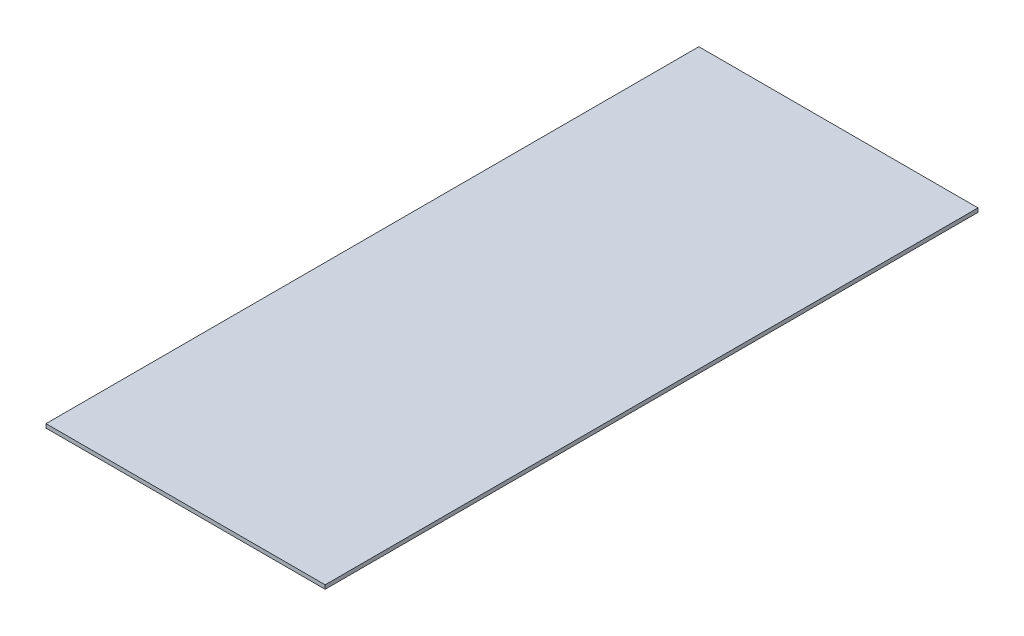
ISO-10303-21;
HEADER;
FILE_DESCRIPTION(('STEP AP214'),'2;1');
FILE_NAME('part.step','',(''),(''),'','','');
FILE_SCHEMA(('AUTOMOTIVE_DESIGN { 1 0 10303 214 1 1 1 1 }'));
ENDSEC;
DATA;
#1=APPLICATION_CONTEXT('core data for automotive mechanical design processes');
#2=APPLICATION_PROTOCOL_DEFINITION('international standard','automotive_design',2000,#1);
#3=PRODUCT_CONTEXT('',#1,'mechanical');
#4=PRODUCT('Part','Part','',(#3));
#5=PRODUCT_RELATED_PRODUCT_CATEGORY('part','',(#4));
#6=PRODUCT_DEFINITION_FORMATION('','',#4);
#7=PRODUCT_DEFINITION_CONTEXT('part definition',#1,'design');
#8=PRODUCT_DEFINITION('design','',#6,#7);
#9=PRODUCT_DEFINITION_SHAPE('','',#8);
#10=(LENGTH_UNIT() NAMED_UNIT(*) SI_UNIT(.MILLI.,.METRE.));
#11=(NAMED_UNIT(*) PLANE_ANGLE_UNIT() SI_UNIT($,.RADIAN.));
#12=(NAMED_UNIT(*) SI_UNIT($,.STERADIAN.) SOLID_ANGLE_UNIT());
#13=UNCERTAINTY_MEASURE_WITH_UNIT(LENGTH_MEASURE(1.E-05),#10,'distance_accuracy_value','');
#14=(GEOMETRIC_REPRESENTATION_CONTEXT(3) GLOBAL_UNCERTAINTY_ASSIGNED_CONTEXT((#13)) GLOBAL_UNIT_ASSIGNED_CONTEXT((#10,
#11,#12)) REPRESENTATION_CONTEXT('',''));
#15=CARTESIAN_POINT('',(0.,0.,0.));
#16=DIRECTION('',(0.,0.,1.));
#17=DIRECTION('',(1.,0.,0.));
#18=AXIS2_PLACEMENT_3D('',#15,#16,#17);
#19=CARTESIAN_POINT('',(0.,5.5,0.));
#20=DIRECTION('',(1.,0.,0.));
#21=DIRECTION('',(0.,0.,-1.));
#22=AXIS2_PLACEMENT_3D('',#19,#20,#21);
#23=PLANE('',#22);
#24=DIRECTION('',(0.,0.,1.));
#25=VECTOR('',#24,1.);
#26=CARTESIAN_POINT('',(0.,0.,0.));
#27=LINE('',#26,#25);
#28=CARTESIAN_POINT('',(0.,0.,0.));
#29=VERTEX_POINT('',#28);
#30=CARTESIAN_POINT('',(1.12759354031493E-13,0.,920.75));
#31=VERTEX_POINT('',#30);
#32=EDGE_CURVE('E113',#29,#31,#27,.T.);
#33=ORIENTED_EDGE('',*,*,#32,.T.);
#34=DIRECTION('',(0.,-1.,0.));
#35=VECTOR('',#34,1.);
#36=CARTESIAN_POINT('',(1.12759354031493E-13,5.5,920.75));
#37=LINE('',#36,#35);
#38=CARTESIAN_POINT('',(1.12759354031493E-13,5.5,920.75));
#39=VERTEX_POINT('',#38);
#40=EDGE_CURVE('E11',#39,#31,#37,.T.);
#41=ORIENTED_EDGE('',*,*,#40,.F.);
#42=DIRECTION('',(0.,0.,1.));
#43=VECTOR('',#42,1.);
#44=CARTESIAN_POINT('',(0.,5.5,0.));
#45=LINE('',#44,#43);
#46=CARTESIAN_POINT('',(0.,5.5,0.));
#47=VERTEX_POINT('',#46);
#48=EDGE_CURVE('E97',#47,#39,#45,.T.);
#49=ORIENTED_EDGE('',*,*,#48,.F.);
#50=DIRECTION('',(0.,-1.,0.));
#51=VECTOR('',#50,1.);
#52=CARTESIAN_POINT('',(0.,5.5,0.));
#53=LINE('',#52,#51);
#54=EDGE_CURVE('E109',#47,#29,#53,.T.);
#55=ORIENTED_EDGE('',*,*,#54,.T.);
#56=EDGE_LOOP('',(#33,#41,#49,#55));
#57=FACE_BOUND('',#56,.T.);
#58=ADVANCED_FACE('F45',(#57),#23,.F.);
#59=CARTESIAN_POINT('',(1.12759354031493E-13,5.5,920.75));
#60=DIRECTION('',(0.,0.,-1.));
#61=DIRECTION('',(-1.,0.,0.));
#62=AXIS2_PLACEMENT_3D('',#59,#60,#61);
#63=PLANE('',#62);
#64=DIRECTION('',(1.,0.,0.));
#65=VECTOR('',#64,1.);
#66=CARTESIAN_POINT('',(1.12759354031493E-13,0.,920.75));
#67=LINE('',#66,#65);
#68=CARTESIAN_POINT('',(393.7,0.,920.75));
#69=VERTEX_POINT('',#68);
#70=EDGE_CURVE('E102',#31,#69,#67,.T.);
#71=ORIENTED_EDGE('',*,*,#70,.T.);
#72=DIRECTION('',(0.,-1.,0.));
#73=VECTOR('',#72,1.);
#74=CARTESIAN_POINT('',(393.7,5.5,920.75));
#75=LINE('',#74,#73);
#76=CARTESIAN_POINT('',(393.7,5.5,920.75));
#77=VERTEX_POINT('',#76);
#78=EDGE_CURVE('E54',#77,#69,#75,.T.);
#79=ORIENTED_EDGE('',*,*,#78,.F.);
#80=DIRECTION('',(1.,0.,0.));
#81=VECTOR('',#80,1.);
#82=CARTESIAN_POINT('',(1.12759354031493E-13,5.5,920.75));
#83=LINE('',#82,#81);
#84=EDGE_CURVE('E92',#39,#77,#83,.T.);
#85=ORIENTED_EDGE('',*,*,#84,.F.);
#86=ORIENTED_EDGE('',*,*,#40,.T.);
#87=EDGE_LOOP('',(#71,#79,#85,#86));
#88=FACE_BOUND('',#87,.T.);
#89=ADVANCED_FACE('F101',(#88),#63,.F.);
#90=CARTESIAN_POINT('',(393.7,5.5,0.));
#91=DIRECTION('',(-1.,0.,0.));
#92=DIRECTION('',(0.,0.,1.));
#93=AXIS2_PLACEMENT_3D('',#90,#91,#92);
#94=PLANE('',#93);
#95=DIRECTION('',(0.,0.,-1.));
#96=VECTOR('',#95,1.);
#97=CARTESIAN_POINT('',(393.7,0.,0.));
#98=LINE('',#97,#96);
#99=CARTESIAN_POINT('',(393.7,0.,0.));
#100=VERTEX_POINT('',#99);
#101=EDGE_CURVE('E79',#69,#100,#98,.T.);
#102=ORIENTED_EDGE('',*,*,#101,.T.);
#103=DIRECTION('',(0.,-1.,0.));
#104=VECTOR('',#103,1.);
#105=CARTESIAN_POINT('',(393.7,5.5,0.));
#106=LINE('',#105,#104);
#107=CARTESIAN_POINT('',(393.7,5.5,0.));
#108=VERTEX_POINT('',#107);
#109=EDGE_CURVE('E104',#108,#100,#106,.T.);
#110=ORIENTED_EDGE('',*,*,#109,.F.);
#111=DIRECTION('',(0.,0.,-1.));
#112=VECTOR('',#111,1.);
#113=CARTESIAN_POINT('',(393.7,5.5,0.));
#114=LINE('',#113,#112);
#115=EDGE_CURVE('E95',#77,#108,#114,.T.);
#116=ORIENTED_EDGE('',*,*,#115,.F.);
#117=ORIENTED_EDGE('',*,*,#78,.T.);
#118=EDGE_LOOP('',(#102,#110,#116,#117));
#119=FACE_BOUND('',#118,.T.);
#120=ADVANCED_FACE('F105',(#119),#94,.F.);
#121=CARTESIAN_POINT('',(0.,5.5,0.));
#122=DIRECTION('',(0.,0.,1.));
#123=DIRECTION('',(1.,0.,0.));
#124=AXIS2_PLACEMENT_3D('',#121,#122,#123);
#125=PLANE('',#124);
#126=DIRECTION('',(-1.,0.,0.));
#127=VECTOR('',#126,1.);
#128=CARTESIAN_POINT('',(0.,0.,0.));
#129=LINE('',#128,#127);
#130=EDGE_CURVE('E85',#100,#29,#129,.T.);
#131=ORIENTED_EDGE('',*,*,#130,.T.);
#132=ORIENTED_EDGE('',*,*,#54,.F.);
#133=DIRECTION('',(-1.,0.,0.));
#134=VECTOR('',#133,1.);
#135=CARTESIAN_POINT('',(0.,5.5,0.));
#136=LINE('',#135,#134);
#137=EDGE_CURVE('E62',#108,#47,#136,.T.);
#138=ORIENTED_EDGE('',*,*,#137,.F.);
#139=ORIENTED_EDGE('',*,*,#109,.T.);
#140=EDGE_LOOP('',(#131,#132,#138,#139));
#141=FACE_BOUND('',#140,.T.);
#142=ADVANCED_FACE('F126',(#141),#125,.F.);
#143=CARTESIAN_POINT('',(0.,5.5,0.));
#144=DIRECTION('',(0.,1.,0.));
#145=DIRECTION('',(0.,0.,1.));
#146=AXIS2_PLACEMENT_3D('',#143,#144,#145);
#147=PLANE('',#146);
#148=ORIENTED_EDGE('',*,*,#48,.T.);
#149=ORIENTED_EDGE('',*,*,#84,.T.);
#150=ORIENTED_EDGE('',*,*,#115,.T.);
#151=ORIENTED_EDGE('',*,*,#137,.T.);
#152=EDGE_LOOP('',(#148,#149,#150,#151));
#153=FACE_BOUND('',#152,.T.);
#154=ADVANCED_FACE('F93',(#153),#147,.T.);
#155=CARTESIAN_POINT('',(0.,0.,0.));
#156=DIRECTION('',(0.,1.,0.));
#157=DIRECTION('',(0.,0.,1.));
#158=AXIS2_PLACEMENT_3D('',#155,#156,#157);
#159=PLANE('',#158);
#160=ORIENTED_EDGE('',*,*,#32,.F.);
#161=ORIENTED_EDGE('',*,*,#130,.F.);
#162=ORIENTED_EDGE('',*,*,#101,.F.);
#163=ORIENTED_EDGE('',*,*,#70,.F.);
#164=EDGE_LOOP('',(#160,#161,#162,#163));
#165=FACE_BOUND('',#164,.T.);
#166=ADVANCED_FACE('F129',(#165),#159,.F.);
#167=CLOSED_SHELL('',(#58,#89,#120,#142,#154,#166));
#168=MANIFOLD_SOLID_BREP('B2',#167);
#169=ADVANCED_BREP_SHAPE_REPRESENTATION('',(#18,#168),#14);
#170=SHAPE_DEFINITION_REPRESENTATION(#9,#169);
ENDSEC;
END-ISO-10303-21;
